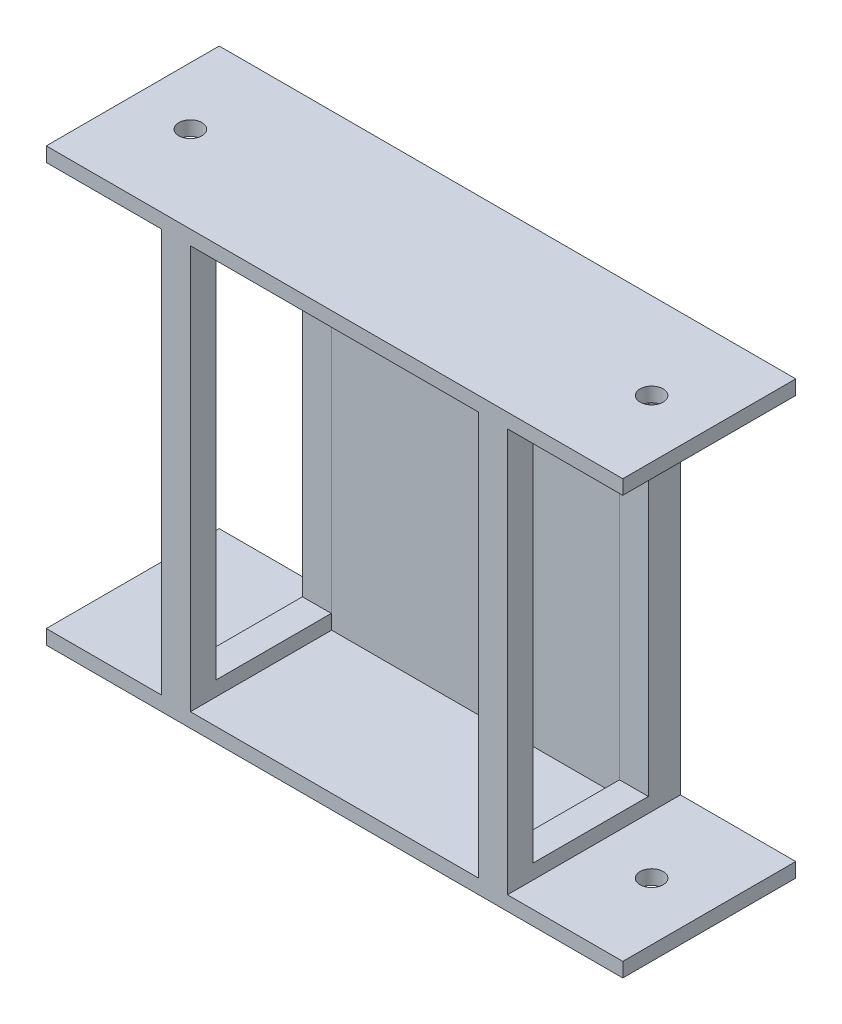
ISO-10303-21;
HEADER;
FILE_DESCRIPTION(('STEP AP214'),'2;1');
FILE_NAME('part.step','',(''),(''),'','','');
FILE_SCHEMA(('AUTOMOTIVE_DESIGN { 1 0 10303 214 1 1 1 1 }'));
ENDSEC;
DATA;
#1=APPLICATION_CONTEXT('core data for automotive mechanical design processes');
#2=APPLICATION_PROTOCOL_DEFINITION('international standard','automotive_design',2000,#1);
#3=PRODUCT_CONTEXT('',#1,'mechanical');
#4=PRODUCT('Part','Part','',(#3));
#5=PRODUCT_RELATED_PRODUCT_CATEGORY('part','',(#4));
#6=PRODUCT_DEFINITION_FORMATION('','',#4);
#7=PRODUCT_DEFINITION_CONTEXT('part definition',#1,'design');
#8=PRODUCT_DEFINITION('design','',#6,#7);
#9=PRODUCT_DEFINITION_SHAPE('','',#8);
#10=(LENGTH_UNIT() NAMED_UNIT(*) SI_UNIT(.MILLI.,.METRE.));
#11=(NAMED_UNIT(*) PLANE_ANGLE_UNIT() SI_UNIT($,.RADIAN.));
#12=(NAMED_UNIT(*) SI_UNIT($,.STERADIAN.) SOLID_ANGLE_UNIT());
#13=UNCERTAINTY_MEASURE_WITH_UNIT(LENGTH_MEASURE(1.E-05),#10,'distance_accuracy_value','');
#14=(GEOMETRIC_REPRESENTATION_CONTEXT(3) GLOBAL_UNCERTAINTY_ASSIGNED_CONTEXT((#13)) GLOBAL_UNIT_ASSIGNED_CONTEXT((#10,
#11,#12)) REPRESENTATION_CONTEXT('',''));
#15=CARTESIAN_POINT('',(0.,0.,0.));
#16=DIRECTION('',(0.,0.,1.));
#17=DIRECTION('',(1.,0.,0.));
#18=AXIS2_PLACEMENT_3D('',#15,#16,#17);
#19=CARTESIAN_POINT('',(-75.9999999999996,-64.9011680442578,11.1304183947294));
#20=DIRECTION('',(0.,0.,-1.));
#21=DIRECTION('',(-1.,0.,0.));
#22=AXIS2_PLACEMENT_3D('',#19,#20,#21);
#23=PLANE('',#22);
#24=DIRECTION('',(1.,0.,0.));
#25=VECTOR('',#24,1.);
#26=CARTESIAN_POINT('',(-75.9999999999996,-64.9011680442578,11.1304183947294));
#27=LINE('',#26,#25);
#28=CARTESIAN_POINT('',(-60.,-64.9011680442577,11.1304183947294));
#29=VERTEX_POINT('',#28);
#30=CARTESIAN_POINT('',(-50.,-64.9011680442576,11.1304183947294));
#31=VERTEX_POINT('',#30);
#32=EDGE_CURVE('E275',#29,#31,#27,.T.);
#33=ORIENTED_EDGE('',*,*,#32,.T.);
#34=DIRECTION('',(0.,1.,0.));
#35=VECTOR('',#34,1.);
#36=CARTESIAN_POINT('',(-50.,-64.9011680442578,11.1304183947294));
#37=LINE('',#36,#35);
#38=CARTESIAN_POINT('',(-50.,65.0988319557424,11.1304183947294));
#39=VERTEX_POINT('',#38);
#40=EDGE_CURVE('E258',#31,#39,#37,.T.);
#41=ORIENTED_EDGE('',*,*,#40,.T.);
#42=DIRECTION('',(1.,0.,0.));
#43=VECTOR('',#42,1.);
#44=CARTESIAN_POINT('',(-76.0000000000006,65.0988319557422,11.1304183947294));
#45=LINE('',#44,#43);
#46=CARTESIAN_POINT('',(-60.,65.0988319557423,11.1304183947294));
#47=VERTEX_POINT('',#46);
#48=EDGE_CURVE('E281',#47,#39,#45,.T.);
#49=ORIENTED_EDGE('',*,*,#48,.F.);
#50=DIRECTION('',(0.,1.,0.));
#51=VECTOR('',#50,1.);
#52=CARTESIAN_POINT('',(-60.,-70.,11.1304183947294));
#53=LINE('',#52,#51);
#54=EDGE_CURVE('E298',#29,#47,#53,.T.);
#55=ORIENTED_EDGE('',*,*,#54,.F.);
#56=EDGE_LOOP('',(#33,#41,#49,#55));
#57=FACE_BOUND('',#56,.T.);
#58=ADVANCED_FACE('F41',(#57),#23,.F.);
#59=CARTESIAN_POINT('',(-75.9999999999996,-64.9011680442578,51.1304183947294));
#60=DIRECTION('',(0.,-1.,0.));
#61=DIRECTION('',(1.,0.,0.));
#62=AXIS2_PLACEMENT_3D('',#59,#60,#61);
#63=PLANE('',#62);
#64=DIRECTION('',(1.,0.,0.));
#65=VECTOR('',#64,1.);
#66=CARTESIAN_POINT('',(-75.9999999999996,-64.9011680442578,51.1304183947294));
#67=LINE('',#66,#65);
#68=CARTESIAN_POINT('',(-60.,-64.9011680442577,51.1304183947294));
#69=VERTEX_POINT('',#68);
#70=CARTESIAN_POINT('',(-50.,-64.9011680442577,51.1304183947294));
#71=VERTEX_POINT('',#70);
#72=EDGE_CURVE('E280',#69,#71,#67,.T.);
#73=ORIENTED_EDGE('',*,*,#72,.T.);
#74=DIRECTION('',(0.,0.,-1.));
#75=VECTOR('',#74,1.);
#76=CARTESIAN_POINT('',(-50.,-64.9011680442576,51.1304183947294));
#77=LINE('',#76,#75);
#78=EDGE_CURVE('E251',#71,#31,#77,.T.);
#79=ORIENTED_EDGE('',*,*,#78,.T.);
#80=ORIENTED_EDGE('',*,*,#32,.F.);
#81=DIRECTION('',(0.,0.,-1.));
#82=VECTOR('',#81,1.);
#83=CARTESIAN_POINT('',(-60.,-64.9011680442577,60.));
#84=LINE('',#83,#82);
#85=EDGE_CURVE('E291',#69,#29,#84,.T.);
#86=ORIENTED_EDGE('',*,*,#85,.F.);
#87=EDGE_LOOP('',(#73,#79,#80,#86));
#88=FACE_BOUND('',#87,.T.);
#89=ADVANCED_FACE('F410',(#88),#63,.F.);
#90=CARTESIAN_POINT('',(-75.9999999999996,-64.9011680442578,51.1304183947294));
#91=DIRECTION('',(0.,0.,1.));
#92=DIRECTION('',(1.,0.,0.));
#93=AXIS2_PLACEMENT_3D('',#90,#91,#92);
#94=PLANE('',#93);
#95=DIRECTION('',(1.,0.,0.));
#96=VECTOR('',#95,1.);
#97=CARTESIAN_POINT('',(-76.0000000000006,65.0988319557422,51.1304183947294));
#98=LINE('',#97,#96);
#99=CARTESIAN_POINT('',(-60.,65.0988319557424,51.1304183947294));
#100=VERTEX_POINT('',#99);
#101=CARTESIAN_POINT('',(-50.,65.0988319557424,51.1304183947294));
#102=VERTEX_POINT('',#101);
#103=EDGE_CURVE('E283',#100,#102,#98,.T.);
#104=ORIENTED_EDGE('',*,*,#103,.T.);
#105=DIRECTION('',(0.,-1.,0.));
#106=VECTOR('',#105,1.);
#107=CARTESIAN_POINT('',(-50.,-64.9011680442578,51.1304183947294));
#108=LINE('',#107,#106);
#109=EDGE_CURVE('E61',#102,#71,#108,.T.);
#110=ORIENTED_EDGE('',*,*,#109,.T.);
#111=ORIENTED_EDGE('',*,*,#72,.F.);
#112=DIRECTION('',(0.,-1.,0.));
#113=VECTOR('',#112,1.);
#114=CARTESIAN_POINT('',(-60.,-70.,51.1304183947294));
#115=LINE('',#114,#113);
#116=EDGE_CURVE('E288',#100,#69,#115,.T.);
#117=ORIENTED_EDGE('',*,*,#116,.F.);
#118=EDGE_LOOP('',(#104,#110,#111,#117));
#119=FACE_BOUND('',#118,.T.);
#120=ADVANCED_FACE('F413',(#119),#94,.F.);
#121=CARTESIAN_POINT('',(-76.0000000000006,65.0988319557422,51.1304183947294));
#122=DIRECTION('',(0.,1.,0.));
#123=DIRECTION('',(-1.,0.,0.));
#124=AXIS2_PLACEMENT_3D('',#121,#122,#123);
#125=PLANE('',#124);
#126=ORIENTED_EDGE('',*,*,#48,.T.);
#127=DIRECTION('',(0.,0.,1.));
#128=VECTOR('',#127,1.);
#129=CARTESIAN_POINT('',(-50.,65.0988319557424,51.1304183947294));
#130=LINE('',#129,#128);
#131=EDGE_CURVE('E11',#39,#102,#130,.T.);
#132=ORIENTED_EDGE('',*,*,#131,.T.);
#133=ORIENTED_EDGE('',*,*,#103,.F.);
#134=DIRECTION('',(0.,0.,1.));
#135=VECTOR('',#134,1.);
#136=CARTESIAN_POINT('',(-60.,65.0988319557424,60.));
#137=LINE('',#136,#135);
#138=EDGE_CURVE('E274',#47,#100,#137,.T.);
#139=ORIENTED_EDGE('',*,*,#138,.F.);
#140=EDGE_LOOP('',(#126,#132,#133,#139));
#141=FACE_BOUND('',#140,.T.);
#142=ADVANCED_FACE('F476',(#141),#125,.F.);
#143=CARTESIAN_POINT('',(100.,75.,60.));
#144=DIRECTION('',(-1.,0.,0.));
#145=DIRECTION('',(0.,0.,1.));
#146=AXIS2_PLACEMENT_3D('',#143,#144,#145);
#147=PLANE('',#146);
#148=DIRECTION('',(0.,1.,0.));
#149=VECTOR('',#148,1.);
#150=CARTESIAN_POINT('',(100.,75.,0.));
#151=LINE('',#150,#149);
#152=CARTESIAN_POINT('',(100.,70.,0.));
#153=VERTEX_POINT('',#152);
#154=CARTESIAN_POINT('',(100.,75.,0.));
#155=VERTEX_POINT('',#154);
#156=EDGE_CURVE('E300',#153,#155,#151,.T.);
#157=ORIENTED_EDGE('',*,*,#156,.T.);
#158=DIRECTION('',(0.,0.,-1.));
#159=VECTOR('',#158,1.);
#160=CARTESIAN_POINT('',(100.,75.,60.));
#161=LINE('',#160,#159);
#162=CARTESIAN_POINT('',(100.,75.,60.));
#163=VERTEX_POINT('',#162);
#164=EDGE_CURVE('E385',#163,#155,#161,.T.);
#165=ORIENTED_EDGE('',*,*,#164,.F.);
#166=DIRECTION('',(0.,1.,0.));
#167=VECTOR('',#166,1.);
#168=CARTESIAN_POINT('',(100.,75.,60.));
#169=LINE('',#168,#167);
#170=CARTESIAN_POINT('',(100.,70.,60.));
#171=VERTEX_POINT('',#170);
#172=EDGE_CURVE('E296',#171,#163,#169,.T.);
#173=ORIENTED_EDGE('',*,*,#172,.F.);
#174=DIRECTION('',(0.,0.,-1.));
#175=VECTOR('',#174,1.);
#176=CARTESIAN_POINT('',(100.,70.,60.));
#177=LINE('',#176,#175);
#178=EDGE_CURVE('E326',#171,#153,#177,.T.);
#179=ORIENTED_EDGE('',*,*,#178,.T.);
#180=EDGE_LOOP('',(#157,#165,#173,#179));
#181=FACE_BOUND('',#180,.T.);
#182=ADVANCED_FACE('F43',(#181),#147,.F.);
#183=CARTESIAN_POINT('',(-100.,75.,60.));
#184=DIRECTION('',(0.,-1.,0.));
#185=DIRECTION('',(0.,0.,-1.));
#186=AXIS2_PLACEMENT_3D('',#183,#184,#185);
#187=PLANE('',#186);
#188=CARTESIAN_POINT('',(-80.,75.,29.999999999999));
#189=DIRECTION('',(0.,-1.,0.));
#190=DIRECTION('',(0.,0.,-1.));
#191=AXIS2_PLACEMENT_3D('',#188,#189,#190);
#192=CIRCLE('',#191,4.00000000000001);
#193=CARTESIAN_POINT('',(-80.,75.,25.9999999999989));
#194=VERTEX_POINT('',#193);
#195=EDGE_CURVE('E227',#194,#194,#192,.T.);
#196=ORIENTED_EDGE('',*,*,#195,.T.);
#197=EDGE_LOOP('',(#196));
#198=FACE_BOUND('',#197,.T.);
#199=CARTESIAN_POINT('',(80.,75.,29.999999999999));
#200=DIRECTION('',(0.,-1.,0.));
#201=DIRECTION('',(0.,0.,-1.));
#202=AXIS2_PLACEMENT_3D('',#199,#200,#201);
#203=CIRCLE('',#202,4.00000000000001);
#204=CARTESIAN_POINT('',(80.,75.,25.9999999999989));
#205=VERTEX_POINT('',#204);
#206=EDGE_CURVE('E486',#205,#205,#203,.T.);
#207=ORIENTED_EDGE('',*,*,#206,.T.);
#208=EDGE_LOOP('',(#207));
#209=FACE_BOUND('',#208,.T.);
#210=DIRECTION('',(-1.,0.,0.));
#211=VECTOR('',#210,1.);
#212=CARTESIAN_POINT('',(-100.,75.,0.));
#213=LINE('',#212,#211);
#214=CARTESIAN_POINT('',(-100.,75.,0.));
#215=VERTEX_POINT('',#214);
#216=EDGE_CURVE('E328',#155,#215,#213,.T.);
#217=ORIENTED_EDGE('',*,*,#216,.T.);
#218=DIRECTION('',(0.,0.,-1.));
#219=VECTOR('',#218,1.);
#220=CARTESIAN_POINT('',(-100.,75.,60.));
#221=LINE('',#220,#219);
#222=CARTESIAN_POINT('',(-100.,75.,60.));
#223=VERTEX_POINT('',#222);
#224=EDGE_CURVE('E377',#223,#215,#221,.T.);
#225=ORIENTED_EDGE('',*,*,#224,.F.);
#226=DIRECTION('',(-1.,0.,0.));
#227=VECTOR('',#226,1.);
#228=CARTESIAN_POINT('',(-100.,75.,60.));
#229=LINE('',#228,#227);
#230=EDGE_CURVE('E305',#163,#223,#229,.T.);
#231=ORIENTED_EDGE('',*,*,#230,.F.);
#232=ORIENTED_EDGE('',*,*,#164,.T.);
#233=EDGE_LOOP('',(#217,#225,#231,#232));
#234=FACE_BOUND('',#233,.T.);
#235=ADVANCED_FACE('F468',(#198,#209,#234),#187,.F.);
#236=CARTESIAN_POINT('',(-100.,70.,60.));
#237=DIRECTION('',(1.,0.,0.));
#238=DIRECTION('',(0.,1.,0.));
#239=AXIS2_PLACEMENT_3D('',#236,#237,#238);
#240=PLANE('',#239);
#241=DIRECTION('',(0.,-1.,0.));
#242=VECTOR('',#241,1.);
#243=CARTESIAN_POINT('',(-100.,70.,0.));
#244=LINE('',#243,#242);
#245=CARTESIAN_POINT('',(-100.,70.,0.));
#246=VERTEX_POINT('',#245);
#247=EDGE_CURVE('E332',#215,#246,#244,.T.);
#248=ORIENTED_EDGE('',*,*,#247,.T.);
#249=DIRECTION('',(0.,0.,-1.));
#250=VECTOR('',#249,1.);
#251=CARTESIAN_POINT('',(-100.,70.,60.));
#252=LINE('',#251,#250);
#253=CARTESIAN_POINT('',(-100.,70.,60.));
#254=VERTEX_POINT('',#253);
#255=EDGE_CURVE('E376',#254,#246,#252,.T.);
#256=ORIENTED_EDGE('',*,*,#255,.F.);
#257=DIRECTION('',(0.,-1.,0.));
#258=VECTOR('',#257,1.);
#259=CARTESIAN_POINT('',(-100.,70.,60.));
#260=LINE('',#259,#258);
#261=EDGE_CURVE('E308',#223,#254,#260,.T.);
#262=ORIENTED_EDGE('',*,*,#261,.F.);
#263=ORIENTED_EDGE('',*,*,#224,.T.);
#264=EDGE_LOOP('',(#248,#256,#262,#263));
#265=FACE_BOUND('',#264,.T.);
#266=ADVANCED_FACE('F469',(#265),#240,.F.);
#267=CARTESIAN_POINT('',(-60.,70.,60.));
#268=DIRECTION('',(0.,1.,0.));
#269=DIRECTION('',(0.,0.,1.));
#270=AXIS2_PLACEMENT_3D('',#267,#268,#269);
#271=PLANE('',#270);
#272=CARTESIAN_POINT('',(-80.,70.,29.999999999999));
#273=DIRECTION('',(0.,1.,0.));
#274=DIRECTION('',(0.,0.,1.));
#275=AXIS2_PLACEMENT_3D('',#272,#273,#274);
#276=CIRCLE('',#275,4.00000000000001);
#277=CARTESIAN_POINT('',(-80.,70.,33.999999999999));
#278=VERTEX_POINT('',#277);
#279=EDGE_CURVE('E531',#278,#278,#276,.T.);
#280=ORIENTED_EDGE('',*,*,#279,.T.);
#281=EDGE_LOOP('',(#280));
#282=FACE_BOUND('',#281,.T.);
#283=DIRECTION('',(1.,0.,0.));
#284=VECTOR('',#283,1.);
#285=CARTESIAN_POINT('',(-60.,70.,0.));
#286=LINE('',#285,#284);
#287=CARTESIAN_POINT('',(-60.,70.,0.));
#288=VERTEX_POINT('',#287);
#289=EDGE_CURVE('E334',#246,#288,#286,.T.);
#290=ORIENTED_EDGE('',*,*,#289,.T.);
#291=DIRECTION('',(0.,0.,-1.));
#292=VECTOR('',#291,1.);
#293=CARTESIAN_POINT('',(-60.,70.,60.));
#294=LINE('',#293,#292);
#295=CARTESIAN_POINT('',(-60.,70.,60.));
#296=VERTEX_POINT('',#295);
#297=EDGE_CURVE('E373',#296,#288,#294,.T.);
#298=ORIENTED_EDGE('',*,*,#297,.F.);
#299=DIRECTION('',(1.,0.,0.));
#300=VECTOR('',#299,1.);
#301=CARTESIAN_POINT('',(-60.,70.,60.));
#302=LINE('',#301,#300);
#303=EDGE_CURVE('E306',#254,#296,#302,.T.);
#304=ORIENTED_EDGE('',*,*,#303,.F.);
#305=ORIENTED_EDGE('',*,*,#255,.T.);
#306=EDGE_LOOP('',(#290,#298,#304,#305));
#307=FACE_BOUND('',#306,.T.);
#308=ADVANCED_FACE('F462',(#282,#307),#271,.F.);
#309=CARTESIAN_POINT('',(-60.,-70.,60.));
#310=DIRECTION('',(1.,0.,0.));
#311=DIRECTION('',(0.,0.,-1.));
#312=AXIS2_PLACEMENT_3D('',#309,#310,#311);
#313=PLANE('',#312);
#314=ORIENTED_EDGE('',*,*,#85,.T.);
#315=ORIENTED_EDGE('',*,*,#54,.T.);
#316=ORIENTED_EDGE('',*,*,#138,.T.);
#317=ORIENTED_EDGE('',*,*,#116,.T.);
#318=EDGE_LOOP('',(#314,#315,#316,#317));
#319=FACE_BOUND('',#318,.T.);
#320=DIRECTION('',(0.,-1.,0.));
#321=VECTOR('',#320,1.);
#322=CARTESIAN_POINT('',(-60.,-70.,0.));
#323=LINE('',#322,#321);
#324=CARTESIAN_POINT('',(-60.,-70.,0.));
#325=VERTEX_POINT('',#324);
#326=EDGE_CURVE('E333',#288,#325,#323,.T.);
#327=ORIENTED_EDGE('',*,*,#326,.T.);
#328=DIRECTION('',(0.,0.,-1.));
#329=VECTOR('',#328,1.);
#330=CARTESIAN_POINT('',(-60.,-70.,60.));
#331=LINE('',#330,#329);
#332=CARTESIAN_POINT('',(-60.,-70.,60.));
#333=VERTEX_POINT('',#332);
#334=EDGE_CURVE('E367',#333,#325,#331,.T.);
#335=ORIENTED_EDGE('',*,*,#334,.F.);
#336=DIRECTION('',(0.,-1.,0.));
#337=VECTOR('',#336,1.);
#338=CARTESIAN_POINT('',(-60.,-70.,60.));
#339=LINE('',#338,#337);
#340=EDGE_CURVE('E309',#296,#333,#339,.T.);
#341=ORIENTED_EDGE('',*,*,#340,.F.);
#342=ORIENTED_EDGE('',*,*,#297,.T.);
#343=EDGE_LOOP('',(#327,#335,#341,#342));
#344=FACE_BOUND('',#343,.T.);
#345=ADVANCED_FACE('F459',(#319,#344),#313,.F.);
#346=CARTESIAN_POINT('',(-100.,-70.,60.));
#347=DIRECTION('',(0.,-1.,0.));
#348=DIRECTION('',(0.,0.,-1.));
#349=AXIS2_PLACEMENT_3D('',#346,#347,#348);
#350=PLANE('',#349);
#351=CARTESIAN_POINT('',(-80.,-70.,30.));
#352=DIRECTION('',(0.,-1.,0.));
#353=DIRECTION('',(0.,0.,-1.));
#354=AXIS2_PLACEMENT_3D('',#351,#352,#353);
#355=CIRCLE('',#354,4.00000000000001);
#356=CARTESIAN_POINT('',(-80.,-70.,26.));
#357=VERTEX_POINT('',#356);
#358=EDGE_CURVE('E530',#357,#357,#355,.T.);
#359=ORIENTED_EDGE('',*,*,#358,.T.);
#360=EDGE_LOOP('',(#359));
#361=FACE_BOUND('',#360,.T.);
#362=DIRECTION('',(-1.,0.,0.));
#363=VECTOR('',#362,1.);
#364=CARTESIAN_POINT('',(-100.,-70.,0.));
#365=LINE('',#364,#363);
#366=CARTESIAN_POINT('',(-100.,-70.,0.));
#367=VERTEX_POINT('',#366);
#368=EDGE_CURVE('E339',#325,#367,#365,.T.);
#369=ORIENTED_EDGE('',*,*,#368,.T.);
#370=DIRECTION('',(0.,0.,-1.));
#371=VECTOR('',#370,1.);
#372=CARTESIAN_POINT('',(-100.,-70.,60.));
#373=LINE('',#372,#371);
#374=CARTESIAN_POINT('',(-100.,-70.,60.));
#375=VERTEX_POINT('',#374);
#376=EDGE_CURVE('E370',#375,#367,#373,.T.);
#377=ORIENTED_EDGE('',*,*,#376,.F.);
#378=DIRECTION('',(-1.,0.,0.));
#379=VECTOR('',#378,1.);
#380=CARTESIAN_POINT('',(-100.,-70.,60.));
#381=LINE('',#380,#379);
#382=EDGE_CURVE('E315',#333,#375,#381,.T.);
#383=ORIENTED_EDGE('',*,*,#382,.F.);
#384=ORIENTED_EDGE('',*,*,#334,.T.);
#385=EDGE_LOOP('',(#369,#377,#383,#384));
#386=FACE_BOUND('',#385,.T.);
#387=ADVANCED_FACE('F453',(#361,#386),#350,.F.);
#388=CARTESIAN_POINT('',(-100.,-75.,60.));
#389=DIRECTION('',(1.,0.,0.));
#390=DIRECTION('',(0.,1.,0.));
#391=AXIS2_PLACEMENT_3D('',#388,#389,#390);
#392=PLANE('',#391);
#393=DIRECTION('',(0.,-1.,0.));
#394=VECTOR('',#393,1.);
#395=CARTESIAN_POINT('',(-100.,-75.,0.));
#396=LINE('',#395,#394);
#397=CARTESIAN_POINT('',(-100.,-75.,0.));
#398=VERTEX_POINT('',#397);
#399=EDGE_CURVE('E340',#367,#398,#396,.T.);
#400=ORIENTED_EDGE('',*,*,#399,.T.);
#401=DIRECTION('',(0.,0.,-1.));
#402=VECTOR('',#401,1.);
#403=CARTESIAN_POINT('',(-100.,-75.,60.));
#404=LINE('',#403,#402);
#405=CARTESIAN_POINT('',(-100.,-75.,60.));
#406=VERTEX_POINT('',#405);
#407=EDGE_CURVE('E365',#406,#398,#404,.T.);
#408=ORIENTED_EDGE('',*,*,#407,.F.);
#409=DIRECTION('',(0.,-1.,0.));
#410=VECTOR('',#409,1.);
#411=CARTESIAN_POINT('',(-100.,-75.,60.));
#412=LINE('',#411,#410);
#413=EDGE_CURVE('E314',#375,#406,#412,.T.);
#414=ORIENTED_EDGE('',*,*,#413,.F.);
#415=ORIENTED_EDGE('',*,*,#376,.T.);
#416=EDGE_LOOP('',(#400,#408,#414,#415));
#417=FACE_BOUND('',#416,.T.);
#418=ADVANCED_FACE('F452',(#417),#392,.F.);
#419=CARTESIAN_POINT('',(100.,-75.,60.));
#420=DIRECTION('',(0.,1.,0.));
#421=DIRECTION('',(0.,0.,1.));
#422=AXIS2_PLACEMENT_3D('',#419,#420,#421);
#423=PLANE('',#422);
#424=CARTESIAN_POINT('',(-80.,-75.,30.));
#425=DIRECTION('',(0.,-1.,0.));
#426=DIRECTION('',(0.,0.,-1.));
#427=AXIS2_PLACEMENT_3D('',#424,#425,#426);
#428=CIRCLE('',#427,4.00000000000001);
#429=CARTESIAN_POINT('',(-80.,-75.,26.));
#430=VERTEX_POINT('',#429);
#431=EDGE_CURVE('E760',#430,#430,#428,.T.);
#432=ORIENTED_EDGE('',*,*,#431,.F.);
#433=EDGE_LOOP('',(#432));
#434=FACE_BOUND('',#433,.T.);
#435=CARTESIAN_POINT('',(80.,-75.,30.));
#436=DIRECTION('',(0.,-1.,0.));
#437=DIRECTION('',(0.,0.,1.));
#438=AXIS2_PLACEMENT_3D('',#435,#436,#437);
#439=CIRCLE('',#438,4.00000000000001);
#440=CARTESIAN_POINT('',(80.,-75.,34.));
#441=VERTEX_POINT('',#440);
#442=EDGE_CURVE('E754',#441,#441,#439,.T.);
#443=ORIENTED_EDGE('',*,*,#442,.F.);
#444=EDGE_LOOP('',(#443));
#445=FACE_BOUND('',#444,.T.);
#446=DIRECTION('',(1.,0.,0.));
#447=VECTOR('',#446,1.);
#448=CARTESIAN_POINT('',(100.,-75.,0.));
#449=LINE('',#448,#447);
#450=CARTESIAN_POINT('',(100.,-75.,0.));
#451=VERTEX_POINT('',#450);
#452=EDGE_CURVE('E342',#398,#451,#449,.T.);
#453=ORIENTED_EDGE('',*,*,#452,.T.);
#454=DIRECTION('',(0.,0.,-1.));
#455=VECTOR('',#454,1.);
#456=CARTESIAN_POINT('',(100.,-75.,60.));
#457=LINE('',#456,#455);
#458=CARTESIAN_POINT('',(100.,-75.,60.));
#459=VERTEX_POINT('',#458);
#460=EDGE_CURVE('E363',#459,#451,#457,.T.);
#461=ORIENTED_EDGE('',*,*,#460,.F.);
#462=DIRECTION('',(1.,0.,0.));
#463=VECTOR('',#462,1.);
#464=CARTESIAN_POINT('',(100.,-75.,60.));
#465=LINE('',#464,#463);
#466=EDGE_CURVE('E316',#406,#459,#465,.T.);
#467=ORIENTED_EDGE('',*,*,#466,.F.);
#468=ORIENTED_EDGE('',*,*,#407,.T.);
#469=EDGE_LOOP('',(#453,#461,#467,#468));
#470=FACE_BOUND('',#469,.T.);
#471=ADVANCED_FACE('F449',(#434,#445,#470),#423,.F.);
#472=CARTESIAN_POINT('',(100.,-70.,60.));
#473=DIRECTION('',(-1.,0.,0.));
#474=DIRECTION('',(0.,0.,1.));
#475=AXIS2_PLACEMENT_3D('',#472,#473,#474);
#476=PLANE('',#475);
#477=DIRECTION('',(0.,1.,0.));
#478=VECTOR('',#477,1.);
#479=CARTESIAN_POINT('',(100.,-70.,0.));
#480=LINE('',#479,#478);
#481=CARTESIAN_POINT('',(100.,-70.,0.));
#482=VERTEX_POINT('',#481);
#483=EDGE_CURVE('E345',#451,#482,#480,.T.);
#484=ORIENTED_EDGE('',*,*,#483,.T.);
#485=DIRECTION('',(0.,0.,-1.));
#486=VECTOR('',#485,1.);
#487=CARTESIAN_POINT('',(100.,-70.,60.));
#488=LINE('',#487,#486);
#489=CARTESIAN_POINT('',(100.,-70.,60.));
#490=VERTEX_POINT('',#489);
#491=EDGE_CURVE('E360',#490,#482,#488,.T.);
#492=ORIENTED_EDGE('',*,*,#491,.F.);
#493=DIRECTION('',(0.,1.,0.));
#494=VECTOR('',#493,1.);
#495=CARTESIAN_POINT('',(100.,-70.,60.));
#496=LINE('',#495,#494);
#497=EDGE_CURVE('E318',#459,#490,#496,.T.);
#498=ORIENTED_EDGE('',*,*,#497,.F.);
#499=ORIENTED_EDGE('',*,*,#460,.T.);
#500=EDGE_LOOP('',(#484,#492,#498,#499));
#501=FACE_BOUND('',#500,.T.);
#502=ADVANCED_FACE('F444',(#501),#476,.F.);
#503=CARTESIAN_POINT('',(60.,-70.,60.));
#504=DIRECTION('',(0.,-1.,0.));
#505=DIRECTION('',(0.,0.,-1.));
#506=AXIS2_PLACEMENT_3D('',#503,#504,#505);
#507=PLANE('',#506);
#508=CARTESIAN_POINT('',(80.,-70.,30.));
#509=DIRECTION('',(0.,-1.,0.));
#510=DIRECTION('',(0.,0.,-1.));
#511=AXIS2_PLACEMENT_3D('',#508,#509,#510);
#512=CIRCLE('',#511,4.00000000000001);
#513=CARTESIAN_POINT('',(80.,-70.,26.));
#514=VERTEX_POINT('',#513);
#515=EDGE_CURVE('E529',#514,#514,#512,.T.);
#516=ORIENTED_EDGE('',*,*,#515,.T.);
#517=EDGE_LOOP('',(#516));
#518=FACE_BOUND('',#517,.T.);
#519=DIRECTION('',(-1.,0.,0.));
#520=VECTOR('',#519,1.);
#521=CARTESIAN_POINT('',(60.,-70.,0.));
#522=LINE('',#521,#520);
#523=CARTESIAN_POINT('',(60.,-70.,0.));
#524=VERTEX_POINT('',#523);
#525=EDGE_CURVE('E343',#482,#524,#522,.T.);
#526=ORIENTED_EDGE('',*,*,#525,.T.);
#527=DIRECTION('',(0.,0.,-1.));
#528=VECTOR('',#527,1.);
#529=CARTESIAN_POINT('',(60.,-70.,60.));
#530=LINE('',#529,#528);
#531=CARTESIAN_POINT('',(60.,-70.,60.));
#532=VERTEX_POINT('',#531);
#533=EDGE_CURVE('E351',#532,#524,#530,.T.);
#534=ORIENTED_EDGE('',*,*,#533,.F.);
#535=DIRECTION('',(-1.,0.,0.));
#536=VECTOR('',#535,1.);
#537=CARTESIAN_POINT('',(60.,-70.,60.));
#538=LINE('',#537,#536);
#539=EDGE_CURVE('E319',#490,#532,#538,.T.);
#540=ORIENTED_EDGE('',*,*,#539,.F.);
#541=ORIENTED_EDGE('',*,*,#491,.T.);
#542=EDGE_LOOP('',(#526,#534,#540,#541));
#543=FACE_BOUND('',#542,.T.);
#544=ADVANCED_FACE('F439',(#518,#543),#507,.F.);
#545=CARTESIAN_POINT('',(60.,70.,60.));
#546=DIRECTION('',(-1.,0.,0.));
#547=DIRECTION('',(0.,0.,1.));
#548=AXIS2_PLACEMENT_3D('',#545,#546,#547);
#549=PLANE('',#548);
#550=DIRECTION('',(0.,0.,1.));
#551=VECTOR('',#550,1.);
#552=CARTESIAN_POINT('',(59.9999999999995,65.0988319557432,51.1304183947294));
#553=LINE('',#552,#551);
#554=CARTESIAN_POINT('',(60.,65.0988319557432,11.1304183947294));
#555=VERTEX_POINT('',#554);
#556=CARTESIAN_POINT('',(59.9999999999995,65.0988319557432,51.1304183947294));
#557=VERTEX_POINT('',#556);
#558=EDGE_CURVE('E265',#555,#557,#553,.T.);
#559=ORIENTED_EDGE('',*,*,#558,.F.);
#560=DIRECTION('',(0.,1.,0.));
#561=VECTOR('',#560,1.);
#562=CARTESIAN_POINT('',(60.0000000000004,-64.9011680442568,11.1304183947294));
#563=LINE('',#562,#561);
#564=CARTESIAN_POINT('',(60.0000000000004,-64.9011680442568,11.1304183947294));
#565=VERTEX_POINT('',#564);
#566=EDGE_CURVE('E259',#565,#555,#563,.T.);
#567=ORIENTED_EDGE('',*,*,#566,.F.);
#568=DIRECTION('',(0.,0.,-1.));
#569=VECTOR('',#568,1.);
#570=CARTESIAN_POINT('',(60.0000000000004,-64.9011680442568,51.1304183947294));
#571=LINE('',#570,#569);
#572=CARTESIAN_POINT('',(60.0000000000004,-64.9011680442568,51.1304183947294));
#573=VERTEX_POINT('',#572);
#574=EDGE_CURVE('E268',#573,#565,#571,.T.);
#575=ORIENTED_EDGE('',*,*,#574,.F.);
#576=DIRECTION('',(0.,-1.,0.));
#577=VECTOR('',#576,1.);
#578=CARTESIAN_POINT('',(60.0000000000004,-64.9011680442568,51.1304183947294));
#579=LINE('',#578,#577);
#580=EDGE_CURVE('E264',#557,#573,#579,.T.);
#581=ORIENTED_EDGE('',*,*,#580,.F.);
#582=EDGE_LOOP('',(#559,#567,#575,#581));
#583=FACE_BOUND('',#582,.T.);
#584=DIRECTION('',(0.,1.,0.));
#585=VECTOR('',#584,1.);
#586=CARTESIAN_POINT('',(60.,70.,0.));
#587=LINE('',#586,#585);
#588=CARTESIAN_POINT('',(60.,70.,0.));
#589=VERTEX_POINT('',#588);
#590=EDGE_CURVE('E350',#524,#589,#587,.T.);
#591=ORIENTED_EDGE('',*,*,#590,.T.);
#592=DIRECTION('',(0.,0.,-1.));
#593=VECTOR('',#592,1.);
#594=CARTESIAN_POINT('',(60.,70.,60.));
#595=LINE('',#594,#593);
#596=CARTESIAN_POINT('',(60.,70.,60.));
#597=VERTEX_POINT('',#596);
#598=EDGE_CURVE('E354',#597,#589,#595,.T.);
#599=ORIENTED_EDGE('',*,*,#598,.F.);
#600=DIRECTION('',(0.,1.,0.));
#601=VECTOR('',#600,1.);
#602=CARTESIAN_POINT('',(60.,70.,60.));
#603=LINE('',#602,#601);
#604=EDGE_CURVE('E325',#532,#597,#603,.T.);
#605=ORIENTED_EDGE('',*,*,#604,.F.);
#606=ORIENTED_EDGE('',*,*,#533,.T.);
#607=EDGE_LOOP('',(#591,#599,#605,#606));
#608=FACE_BOUND('',#607,.T.);
#609=ADVANCED_FACE('F396',(#583,#608),#549,.F.);
#610=CARTESIAN_POINT('',(100.,70.,60.));
#611=DIRECTION('',(0.,1.,0.));
#612=DIRECTION('',(0.,0.,1.));
#613=AXIS2_PLACEMENT_3D('',#610,#611,#612);
#614=PLANE('',#613);
#615=CARTESIAN_POINT('',(80.,70.,29.999999999999));
#616=DIRECTION('',(0.,1.,0.));
#617=DIRECTION('',(0.,0.,1.));
#618=AXIS2_PLACEMENT_3D('',#615,#616,#617);
#619=CIRCLE('',#618,4.00000000000001);
#620=CARTESIAN_POINT('',(80.,70.,33.999999999999));
#621=VERTEX_POINT('',#620);
#622=EDGE_CURVE('E44',#621,#621,#619,.T.);
#623=ORIENTED_EDGE('',*,*,#622,.T.);
#624=EDGE_LOOP('',(#623));
#625=FACE_BOUND('',#624,.T.);
#626=DIRECTION('',(1.,0.,0.));
#627=VECTOR('',#626,1.);
#628=CARTESIAN_POINT('',(100.,70.,0.));
#629=LINE('',#628,#627);
#630=EDGE_CURVE('E301',#589,#153,#629,.T.);
#631=ORIENTED_EDGE('',*,*,#630,.T.);
#632=ORIENTED_EDGE('',*,*,#178,.F.);
#633=DIRECTION('',(1.,0.,0.));
#634=VECTOR('',#633,1.);
#635=CARTESIAN_POINT('',(100.,70.,60.));
#636=LINE('',#635,#634);
#637=EDGE_CURVE('E322',#597,#171,#636,.T.);
#638=ORIENTED_EDGE('',*,*,#637,.F.);
#639=ORIENTED_EDGE('',*,*,#598,.T.);
#640=EDGE_LOOP('',(#631,#632,#638,#639));
#641=FACE_BOUND('',#640,.T.);
#642=ADVANCED_FACE('F431',(#625,#641),#614,.F.);
#643=CARTESIAN_POINT('',(0.,0.,60.));
#644=DIRECTION('',(0.,0.,-1.));
#645=DIRECTION('',(-1.,0.,0.));
#646=AXIS2_PLACEMENT_3D('',#643,#644,#645);
#647=PLANE('',#646);
#648=DIRECTION('',(1.,0.,0.));
#649=VECTOR('',#648,1.);
#650=CARTESIAN_POINT('',(50.,-70.,60.0000000000001));
#651=LINE('',#650,#649);
#652=CARTESIAN_POINT('',(-50.,-70.,60.));
#653=VERTEX_POINT('',#652);
#654=CARTESIAN_POINT('',(50.,-70.,60.0000000000001));
#655=VERTEX_POINT('',#654);
#656=EDGE_CURVE('E231',#653,#655,#651,.T.);
#657=ORIENTED_EDGE('',*,*,#656,.F.);
#658=DIRECTION('',(0.,-1.,0.));
#659=VECTOR('',#658,1.);
#660=CARTESIAN_POINT('',(-50.,-70.,60.0000000000001));
#661=LINE('',#660,#659);
#662=CARTESIAN_POINT('',(-50.,70.,60.0000000000001));
#663=VERTEX_POINT('',#662);
#664=EDGE_CURVE('E60',#663,#653,#661,.T.);
#665=ORIENTED_EDGE('',*,*,#664,.F.);
#666=DIRECTION('',(-1.,0.,0.));
#667=VECTOR('',#666,1.);
#668=CARTESIAN_POINT('',(50.,70.,60.0000000000001));
#669=LINE('',#668,#667);
#670=CARTESIAN_POINT('',(50.,70.,60.0000000000001));
#671=VERTEX_POINT('',#670);
#672=EDGE_CURVE('E225',#671,#663,#669,.T.);
#673=ORIENTED_EDGE('',*,*,#672,.F.);
#674=DIRECTION('',(0.,1.,0.));
#675=VECTOR('',#674,1.);
#676=CARTESIAN_POINT('',(50.,-70.,60.0000000000001));
#677=LINE('',#676,#675);
#678=EDGE_CURVE('E223',#655,#671,#677,.T.);
#679=ORIENTED_EDGE('',*,*,#678,.F.);
#680=EDGE_LOOP('',(#657,#665,#673,#679));
#681=FACE_BOUND('',#680,.T.);
#682=ORIENTED_EDGE('',*,*,#172,.T.);
#683=ORIENTED_EDGE('',*,*,#230,.T.);
#684=ORIENTED_EDGE('',*,*,#261,.T.);
#685=ORIENTED_EDGE('',*,*,#303,.T.);
#686=ORIENTED_EDGE('',*,*,#340,.T.);
#687=ORIENTED_EDGE('',*,*,#382,.T.);
#688=ORIENTED_EDGE('',*,*,#413,.T.);
#689=ORIENTED_EDGE('',*,*,#466,.T.);
#690=ORIENTED_EDGE('',*,*,#497,.T.);
#691=ORIENTED_EDGE('',*,*,#539,.T.);
#692=ORIENTED_EDGE('',*,*,#604,.T.);
#693=ORIENTED_EDGE('',*,*,#637,.T.);
#694=EDGE_LOOP('',(#682,#683,#684,#685,#686,#687,#688,#689,#690,#691,#692,#693));
#695=FACE_BOUND('',#694,.T.);
#696=ADVANCED_FACE('F428',(#681,#695),#647,.F.);
#697=CARTESIAN_POINT('',(0.,0.,0.));
#698=DIRECTION('',(0.,0.,-1.));
#699=DIRECTION('',(-1.,0.,0.));
#700=AXIS2_PLACEMENT_3D('',#697,#698,#699);
#701=PLANE('',#700);
#702=ORIENTED_EDGE('',*,*,#156,.F.);
#703=ORIENTED_EDGE('',*,*,#630,.F.);
#704=ORIENTED_EDGE('',*,*,#590,.F.);
#705=ORIENTED_EDGE('',*,*,#525,.F.);
#706=ORIENTED_EDGE('',*,*,#483,.F.);
#707=ORIENTED_EDGE('',*,*,#452,.F.);
#708=ORIENTED_EDGE('',*,*,#399,.F.);
#709=ORIENTED_EDGE('',*,*,#368,.F.);
#710=ORIENTED_EDGE('',*,*,#326,.F.);
#711=ORIENTED_EDGE('',*,*,#289,.F.);
#712=ORIENTED_EDGE('',*,*,#247,.F.);
#713=ORIENTED_EDGE('',*,*,#216,.F.);
#714=EDGE_LOOP('',(#702,#703,#704,#705,#706,#707,#708,#709,#710,#711,#712,#713));
#715=FACE_BOUND('',#714,.T.);
#716=ADVANCED_FACE('F418',(#715),#701,.T.);
#717=CARTESIAN_POINT('',(50.,65.0988319557431,11.1304183947294));
#718=VERTEX_POINT('',#717);
#719=EDGE_CURVE('E271',#718,#555,#45,.T.);
#720=ORIENTED_EDGE('',*,*,#719,.F.);
#721=DIRECTION('',(0.,-1.,0.));
#722=VECTOR('',#721,1.);
#723=CARTESIAN_POINT('',(50.,-64.9011680442578,11.1304183947294));
#724=LINE('',#723,#722);
#725=CARTESIAN_POINT('',(50.,-64.9011680442569,11.1304183947294));
#726=VERTEX_POINT('',#725);
#727=EDGE_CURVE('E246',#718,#726,#724,.T.);
#728=ORIENTED_EDGE('',*,*,#727,.T.);
#729=EDGE_CURVE('E277',#726,#565,#27,.T.);
#730=ORIENTED_EDGE('',*,*,#729,.T.);
#731=ORIENTED_EDGE('',*,*,#566,.T.);
#732=EDGE_LOOP('',(#720,#728,#730,#731));
#733=FACE_BOUND('',#732,.T.);
#734=ADVANCED_FACE('F394',(#733),#23,.F.);
#735=ORIENTED_EDGE('',*,*,#729,.F.);
#736=DIRECTION('',(0.,0.,1.));
#737=VECTOR('',#736,1.);
#738=CARTESIAN_POINT('',(50.,-64.9011680442569,51.1304183947294));
#739=LINE('',#738,#737);
#740=CARTESIAN_POINT('',(50.,-64.9011680442577,51.1304183947294));
#741=VERTEX_POINT('',#740);
#742=EDGE_CURVE('E247',#726,#741,#739,.T.);
#743=ORIENTED_EDGE('',*,*,#742,.T.);
#744=EDGE_CURVE('E278',#741,#573,#67,.T.);
#745=ORIENTED_EDGE('',*,*,#744,.T.);
#746=ORIENTED_EDGE('',*,*,#574,.T.);
#747=EDGE_LOOP('',(#735,#743,#745,#746));
#748=FACE_BOUND('',#747,.T.);
#749=ADVANCED_FACE('F408',(#748),#63,.F.);
#750=ORIENTED_EDGE('',*,*,#744,.F.);
#751=DIRECTION('',(0.,1.,0.));
#752=VECTOR('',#751,1.);
#753=CARTESIAN_POINT('',(50.,-64.9011680442578,51.1304183947294));
#754=LINE('',#753,#752);
#755=CARTESIAN_POINT('',(50.,65.0988319557431,51.1304183947294));
#756=VERTEX_POINT('',#755);
#757=EDGE_CURVE('E238',#741,#756,#754,.T.);
#758=ORIENTED_EDGE('',*,*,#757,.T.);
#759=EDGE_CURVE('E285',#756,#557,#98,.T.);
#760=ORIENTED_EDGE('',*,*,#759,.T.);
#761=ORIENTED_EDGE('',*,*,#580,.T.);
#762=EDGE_LOOP('',(#750,#758,#760,#761));
#763=FACE_BOUND('',#762,.T.);
#764=ADVANCED_FACE('F401',(#763),#94,.F.);
#765=ORIENTED_EDGE('',*,*,#759,.F.);
#766=DIRECTION('',(0.,0.,-1.));
#767=VECTOR('',#766,1.);
#768=CARTESIAN_POINT('',(50.,65.0988319557431,51.1304183947294));
#769=LINE('',#768,#767);
#770=EDGE_CURVE('E49',#756,#718,#769,.T.);
#771=ORIENTED_EDGE('',*,*,#770,.T.);
#772=ORIENTED_EDGE('',*,*,#719,.T.);
#773=ORIENTED_EDGE('',*,*,#558,.T.);
#774=EDGE_LOOP('',(#765,#771,#772,#773));
#775=FACE_BOUND('',#774,.T.);
#776=ADVANCED_FACE('F386',(#775),#125,.F.);
#777=CARTESIAN_POINT('',(-50.,-70.,11.0000000000001));
#778=DIRECTION('',(-1.,0.,0.));
#779=DIRECTION('',(0.,0.,1.));
#780=AXIS2_PLACEMENT_3D('',#777,#778,#779);
#781=PLANE('',#780);
#782=ORIENTED_EDGE('',*,*,#664,.T.);
#783=DIRECTION('',(0.,0.,1.));
#784=VECTOR('',#783,1.);
#785=CARTESIAN_POINT('',(-50.,-70.,11.0000000000001));
#786=LINE('',#785,#784);
#787=CARTESIAN_POINT('',(-50.,-70.,11.0000000000001));
#788=VERTEX_POINT('',#787);
#789=EDGE_CURVE('E199',#788,#653,#786,.T.);
#790=ORIENTED_EDGE('',*,*,#789,.F.);
#791=DIRECTION('',(0.,-1.,0.));
#792=VECTOR('',#791,1.);
#793=CARTESIAN_POINT('',(-50.,-70.,11.0000000000001));
#794=LINE('',#793,#792);
#795=CARTESIAN_POINT('',(-50.,70.,11.0000000000001));
#796=VERTEX_POINT('',#795);
#797=EDGE_CURVE('E204',#796,#788,#794,.T.);
#798=ORIENTED_EDGE('',*,*,#797,.F.);
#799=DIRECTION('',(0.,0.,1.));
#800=VECTOR('',#799,1.);
#801=CARTESIAN_POINT('',(-50.,70.,11.0000000000001));
#802=LINE('',#801,#800);
#803=EDGE_CURVE('E236',#796,#663,#802,.T.);
#804=ORIENTED_EDGE('',*,*,#803,.T.);
#805=EDGE_LOOP('',(#782,#790,#798,#804));
#806=FACE_BOUND('',#805,.T.);
#807=ORIENTED_EDGE('',*,*,#78,.F.);
#808=ORIENTED_EDGE('',*,*,#109,.F.);
#809=ORIENTED_EDGE('',*,*,#131,.F.);
#810=ORIENTED_EDGE('',*,*,#40,.F.);
#811=EDGE_LOOP('',(#807,#808,#809,#810));
#812=FACE_BOUND('',#811,.T.);
#813=ADVANCED_FACE('F205',(#806,#812),#781,.F.);
#814=CARTESIAN_POINT('',(50.,-70.,11.0000000000001));
#815=DIRECTION('',(1.,0.,0.));
#816=DIRECTION('',(0.,0.,-1.));
#817=AXIS2_PLACEMENT_3D('',#814,#815,#816);
#818=PLANE('',#817);
#819=ORIENTED_EDGE('',*,*,#678,.T.);
#820=DIRECTION('',(0.,0.,1.));
#821=VECTOR('',#820,1.);
#822=CARTESIAN_POINT('',(50.,70.,11.0000000000001));
#823=LINE('',#822,#821);
#824=CARTESIAN_POINT('',(50.,70.,11.0000000000001));
#825=VERTEX_POINT('',#824);
#826=EDGE_CURVE('E243',#825,#671,#823,.T.);
#827=ORIENTED_EDGE('',*,*,#826,.F.);
#828=DIRECTION('',(0.,1.,0.));
#829=VECTOR('',#828,1.);
#830=CARTESIAN_POINT('',(50.,-70.,11.0000000000001));
#831=LINE('',#830,#829);
#832=CARTESIAN_POINT('',(50.,-70.,11.0000000000001));
#833=VERTEX_POINT('',#832);
#834=EDGE_CURVE('E217',#833,#825,#831,.T.);
#835=ORIENTED_EDGE('',*,*,#834,.F.);
#836=DIRECTION('',(0.,0.,1.));
#837=VECTOR('',#836,1.);
#838=CARTESIAN_POINT('',(50.,-70.,11.0000000000001));
#839=LINE('',#838,#837);
#840=EDGE_CURVE('E207',#833,#655,#839,.T.);
#841=ORIENTED_EDGE('',*,*,#840,.T.);
#842=EDGE_LOOP('',(#819,#827,#835,#841));
#843=FACE_BOUND('',#842,.T.);
#844=ORIENTED_EDGE('',*,*,#770,.F.);
#845=ORIENTED_EDGE('',*,*,#757,.F.);
#846=ORIENTED_EDGE('',*,*,#742,.F.);
#847=ORIENTED_EDGE('',*,*,#727,.F.);
#848=EDGE_LOOP('',(#844,#845,#846,#847));
#849=FACE_BOUND('',#848,.T.);
#850=ADVANCED_FACE('F404',(#843,#849),#818,.F.);
#851=CARTESIAN_POINT('',(50.,70.,11.0000000000001));
#852=DIRECTION('',(0.,1.,0.));
#853=DIRECTION('',(0.,0.,1.));
#854=AXIS2_PLACEMENT_3D('',#851,#852,#853);
#855=PLANE('',#854);
#856=ORIENTED_EDGE('',*,*,#672,.T.);
#857=ORIENTED_EDGE('',*,*,#803,.F.);
#858=DIRECTION('',(-1.,0.,0.));
#859=VECTOR('',#858,1.);
#860=CARTESIAN_POINT('',(50.,70.,11.0000000000001));
#861=LINE('',#860,#859);
#862=EDGE_CURVE('E209',#825,#796,#861,.T.);
#863=ORIENTED_EDGE('',*,*,#862,.F.);
#864=ORIENTED_EDGE('',*,*,#826,.T.);
#865=EDGE_LOOP('',(#856,#857,#863,#864));
#866=FACE_BOUND('',#865,.T.);
#867=ADVANCED_FACE('F559',(#866),#855,.F.);
#868=CARTESIAN_POINT('',(50.,-70.,11.0000000000001));
#869=DIRECTION('',(0.,-1.,0.));
#870=DIRECTION('',(0.,0.,-1.));
#871=AXIS2_PLACEMENT_3D('',#868,#869,#870);
#872=PLANE('',#871);
#873=ORIENTED_EDGE('',*,*,#656,.T.);
#874=ORIENTED_EDGE('',*,*,#840,.F.);
#875=DIRECTION('',(1.,0.,0.));
#876=VECTOR('',#875,1.);
#877=CARTESIAN_POINT('',(50.,-70.,11.0000000000001));
#878=LINE('',#877,#876);
#879=EDGE_CURVE('E213',#788,#833,#878,.T.);
#880=ORIENTED_EDGE('',*,*,#879,.F.);
#881=ORIENTED_EDGE('',*,*,#789,.T.);
#882=EDGE_LOOP('',(#873,#874,#880,#881));
#883=FACE_BOUND('',#882,.T.);
#884=ADVANCED_FACE('F212',(#883),#872,.F.);
#885=CARTESIAN_POINT('',(0.,0.,11.0000000000001));
#886=DIRECTION('',(0.,0.,1.));
#887=DIRECTION('',(1.,0.,0.));
#888=AXIS2_PLACEMENT_3D('',#885,#886,#887);
#889=PLANE('',#888);
#890=ORIENTED_EDGE('',*,*,#797,.T.);
#891=ORIENTED_EDGE('',*,*,#879,.T.);
#892=ORIENTED_EDGE('',*,*,#834,.T.);
#893=ORIENTED_EDGE('',*,*,#862,.T.);
#894=EDGE_LOOP('',(#890,#891,#892,#893));
#895=FACE_BOUND('',#894,.T.);
#896=ADVANCED_FACE('F219',(#895),#889,.T.);
#897=CARTESIAN_POINT('',(80.,123.,29.9999999999986));
#898=DIRECTION('',(0.,-1.,0.));
#899=DIRECTION('',(0.,0.,-1.));
#900=AXIS2_PLACEMENT_3D('',#897,#898,#899);
#901=CYLINDRICAL_SURFACE('',#900,4.00000000000001);
#902=ORIENTED_EDGE('',*,*,#622,.F.);
#903=EDGE_LOOP('',(#902));
#904=FACE_BOUND('',#903,.T.);
#905=ORIENTED_EDGE('',*,*,#206,.F.);
#906=EDGE_LOOP('',(#905));
#907=FACE_BOUND('',#906,.T.);
#908=ADVANCED_FACE('F555',(#904,#907),#901,.F.);
#909=ORIENTED_EDGE('',*,*,#442,.T.);
#910=EDGE_LOOP('',(#909));
#911=FACE_BOUND('',#910,.T.);
#912=ORIENTED_EDGE('',*,*,#515,.F.);
#913=EDGE_LOOP('',(#912));
#914=FACE_BOUND('',#913,.T.);
#915=ADVANCED_FACE('F548',(#911,#914),#901,.F.);
#916=CARTESIAN_POINT('',(-80.,123.,29.9999999999986));
#917=DIRECTION('',(0.,-1.,0.));
#918=DIRECTION('',(0.,0.,-1.));
#919=AXIS2_PLACEMENT_3D('',#916,#917,#918);
#920=CYLINDRICAL_SURFACE('',#919,4.00000000000001);
#921=ORIENTED_EDGE('',*,*,#431,.T.);
#922=EDGE_LOOP('',(#921));
#923=FACE_BOUND('',#922,.T.);
#924=ORIENTED_EDGE('',*,*,#358,.F.);
#925=EDGE_LOOP('',(#924));
#926=FACE_BOUND('',#925,.T.);
#927=ADVANCED_FACE('F542',(#923,#926),#920,.F.);
#928=ORIENTED_EDGE('',*,*,#279,.F.);
#929=EDGE_LOOP('',(#928));
#930=FACE_BOUND('',#929,.T.);
#931=ORIENTED_EDGE('',*,*,#195,.F.);
#932=EDGE_LOOP('',(#931));
#933=FACE_BOUND('',#932,.T.);
#934=ADVANCED_FACE('F541',(#930,#933),#920,.F.);
#935=CLOSED_SHELL('',(#58,#89,#120,#142,#182,#235,#266,#308,#345,#387,#418,#471,#502,#544,#609,
#642,#696,#716,#734,#749,#764,#776,#813,#850,#867,#884,#896,#908,#915,#927,#934));
#936=MANIFOLD_SOLID_BREP('B2',#935);
#937=ADVANCED_BREP_SHAPE_REPRESENTATION('',(#18,#936),#14);
#938=SHAPE_DEFINITION_REPRESENTATION(#9,#937);
ENDSEC;
END-ISO-10303-21;
